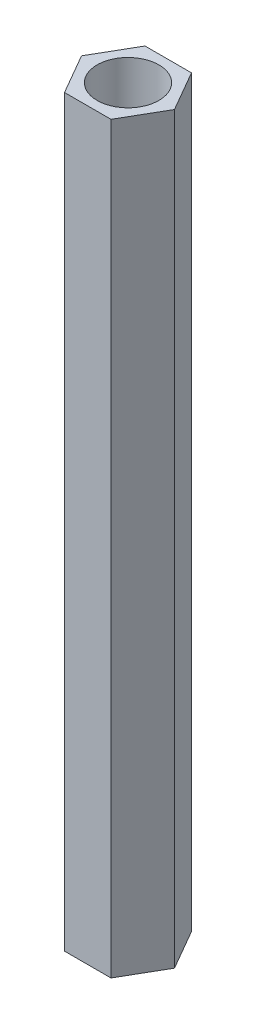
ISO-10303-21;
HEADER;
FILE_DESCRIPTION(('STEP AP214'),'2;1');
FILE_NAME('part.step','',(''),(''),'','','');
FILE_SCHEMA(('AUTOMOTIVE_DESIGN { 1 0 10303 214 1 1 1 1 }'));
ENDSEC;
DATA;
#1=APPLICATION_CONTEXT('core data for automotive mechanical design processes');
#2=APPLICATION_PROTOCOL_DEFINITION('international standard','automotive_design',2000,#1);
#3=PRODUCT_CONTEXT('',#1,'mechanical');
#4=PRODUCT('Part','Part','',(#3));
#5=PRODUCT_RELATED_PRODUCT_CATEGORY('part','',(#4));
#6=PRODUCT_DEFINITION_FORMATION('','',#4);
#7=PRODUCT_DEFINITION_CONTEXT('part definition',#1,'design');
#8=PRODUCT_DEFINITION('design','',#6,#7);
#9=PRODUCT_DEFINITION_SHAPE('','',#8);
#10=(LENGTH_UNIT() NAMED_UNIT(*) SI_UNIT(.MILLI.,.METRE.));
#11=(NAMED_UNIT(*) PLANE_ANGLE_UNIT() SI_UNIT($,.RADIAN.));
#12=(NAMED_UNIT(*) SI_UNIT($,.STERADIAN.) SOLID_ANGLE_UNIT());
#13=UNCERTAINTY_MEASURE_WITH_UNIT(LENGTH_MEASURE(1.E-05),#10,'distance_accuracy_value','');
#14=(GEOMETRIC_REPRESENTATION_CONTEXT(3) GLOBAL_UNCERTAINTY_ASSIGNED_CONTEXT((#13)) GLOBAL_UNIT_ASSIGNED_CONTEXT((#10,
#11,#12)) REPRESENTATION_CONTEXT('',''));
#15=CARTESIAN_POINT('',(0.,0.,0.));
#16=DIRECTION('',(0.,0.,1.));
#17=DIRECTION('',(1.,0.,0.));
#18=AXIS2_PLACEMENT_3D('',#15,#16,#17);
#19=CARTESIAN_POINT('',(1.25000000000002,40.,2.16506350946108));
#20=DIRECTION('',(-0.866025403784441,0.,-0.499999999999995));
#21=DIRECTION('',(-0.499999999999995,0.,0.866025403784441));
#22=AXIS2_PLACEMENT_3D('',#19,#20,#21);
#23=PLANE('',#22);
#24=DIRECTION('',(0.499999999999995,0.,-0.866025403784441));
#25=VECTOR('',#24,1.);
#26=CARTESIAN_POINT('',(1.25000000000002,0.,2.16506350946108));
#27=LINE('',#26,#25);
#28=CARTESIAN_POINT('',(1.25000000000002,0.,2.16506350946108));
#29=VERTEX_POINT('',#28);
#30=CARTESIAN_POINT('',(2.5,0.,0.));
#31=VERTEX_POINT('',#30);
#32=EDGE_CURVE('E118',#29,#31,#27,.T.);
#33=ORIENTED_EDGE('',*,*,#32,.T.);
#34=DIRECTION('',(0.,-1.,0.));
#35=VECTOR('',#34,1.);
#36=CARTESIAN_POINT('',(2.5,40.,0.));
#37=LINE('',#36,#35);
#38=CARTESIAN_POINT('',(2.5,40.,0.));
#39=VERTEX_POINT('',#38);
#40=EDGE_CURVE('E11',#39,#31,#37,.T.);
#41=ORIENTED_EDGE('',*,*,#40,.F.);
#42=DIRECTION('',(0.499999999999995,0.,-0.866025403784441));
#43=VECTOR('',#42,1.);
#44=CARTESIAN_POINT('',(1.25000000000002,40.,2.16506350946108));
#45=LINE('',#44,#43);
#46=CARTESIAN_POINT('',(1.25000000000002,40.,2.16506350946108));
#47=VERTEX_POINT('',#46);
#48=EDGE_CURVE('E129',#47,#39,#45,.T.);
#49=ORIENTED_EDGE('',*,*,#48,.F.);
#50=DIRECTION('',(0.,-1.,0.));
#51=VECTOR('',#50,1.);
#52=CARTESIAN_POINT('',(1.25000000000002,40.,2.16506350946108));
#53=LINE('',#52,#51);
#54=EDGE_CURVE('E114',#47,#29,#53,.T.);
#55=ORIENTED_EDGE('',*,*,#54,.T.);
#56=EDGE_LOOP('',(#33,#41,#49,#55));
#57=FACE_BOUND('',#56,.T.);
#58=ADVANCED_FACE('F34',(#57),#23,.F.);
#59=CARTESIAN_POINT('',(2.5,40.,0.));
#60=DIRECTION('',(-0.866025403784438,0.,0.500000000000001));
#61=DIRECTION('',(0.500000000000001,0.,0.866025403784438));
#62=AXIS2_PLACEMENT_3D('',#59,#60,#61);
#63=PLANE('',#62);
#64=DIRECTION('',(-0.500000000000001,0.,-0.866025403784438));
#65=VECTOR('',#64,1.);
#66=CARTESIAN_POINT('',(2.5,0.,0.));
#67=LINE('',#66,#65);
#68=CARTESIAN_POINT('',(1.24999999999999,0.,-2.1650635094611));
#69=VERTEX_POINT('',#68);
#70=EDGE_CURVE('E121',#31,#69,#67,.T.);
#71=ORIENTED_EDGE('',*,*,#70,.T.);
#72=DIRECTION('',(0.,-1.,0.));
#73=VECTOR('',#72,1.);
#74=CARTESIAN_POINT('',(1.24999999999999,40.,-2.1650635094611));
#75=LINE('',#74,#73);
#76=CARTESIAN_POINT('',(1.24999999999999,40.,-2.1650635094611));
#77=VERTEX_POINT('',#76);
#78=EDGE_CURVE('E42',#77,#69,#75,.T.);
#79=ORIENTED_EDGE('',*,*,#78,.F.);
#80=DIRECTION('',(-0.500000000000001,0.,-0.866025403784438));
#81=VECTOR('',#80,1.);
#82=CARTESIAN_POINT('',(2.5,40.,0.));
#83=LINE('',#82,#81);
#84=EDGE_CURVE('E87',#39,#77,#83,.T.);
#85=ORIENTED_EDGE('',*,*,#84,.F.);
#86=ORIENTED_EDGE('',*,*,#40,.T.);
#87=EDGE_LOOP('',(#71,#79,#85,#86));
#88=FACE_BOUND('',#87,.T.);
#89=ADVANCED_FACE('F154',(#88),#63,.F.);
#90=CARTESIAN_POINT('',(1.24999999999999,40.,-2.1650635094611));
#91=DIRECTION('',(0.,0.,1.));
#92=DIRECTION('',(1.,0.,0.));
#93=AXIS2_PLACEMENT_3D('',#90,#91,#92);
#94=PLANE('',#93);
#95=DIRECTION('',(-1.,0.,0.));
#96=VECTOR('',#95,1.);
#97=CARTESIAN_POINT('',(1.24999999999999,0.,-2.1650635094611));
#98=LINE('',#97,#96);
#99=CARTESIAN_POINT('',(-1.25000000000001,0.,-2.16506350946109));
#100=VERTEX_POINT('',#99);
#101=EDGE_CURVE('E124',#69,#100,#98,.T.);
#102=ORIENTED_EDGE('',*,*,#101,.T.);
#103=DIRECTION('',(0.,-1.,0.));
#104=VECTOR('',#103,1.);
#105=CARTESIAN_POINT('',(-1.25000000000001,40.,-2.16506350946109));
#106=LINE('',#105,#104);
#107=CARTESIAN_POINT('',(-1.25000000000001,40.,-2.16506350946109));
#108=VERTEX_POINT('',#107);
#109=EDGE_CURVE('E109',#108,#100,#106,.T.);
#110=ORIENTED_EDGE('',*,*,#109,.F.);
#111=DIRECTION('',(-1.,0.,0.));
#112=VECTOR('',#111,1.);
#113=CARTESIAN_POINT('',(1.24999999999999,40.,-2.1650635094611));
#114=LINE('',#113,#112);
#115=EDGE_CURVE('E100',#77,#108,#114,.T.);
#116=ORIENTED_EDGE('',*,*,#115,.F.);
#117=ORIENTED_EDGE('',*,*,#78,.T.);
#118=EDGE_LOOP('',(#102,#110,#116,#117));
#119=FACE_BOUND('',#118,.T.);
#120=ADVANCED_FACE('F135',(#119),#94,.F.);
#121=CARTESIAN_POINT('',(-1.25000000000001,40.,-2.16506350946109));
#122=DIRECTION('',(0.866025403784442,0.,0.499999999999995));
#123=DIRECTION('',(0.499999999999995,0.,-0.866025403784442));
#124=AXIS2_PLACEMENT_3D('',#121,#122,#123);
#125=PLANE('',#124);
#126=DIRECTION('',(-0.499999999999995,0.,0.866025403784442));
#127=VECTOR('',#126,1.);
#128=CARTESIAN_POINT('',(-1.25000000000001,0.,-2.16506350946109));
#129=LINE('',#128,#127);
#130=CARTESIAN_POINT('',(-2.5,0.,0.));
#131=VERTEX_POINT('',#130);
#132=EDGE_CURVE('E108',#100,#131,#129,.T.);
#133=ORIENTED_EDGE('',*,*,#132,.T.);
#134=DIRECTION('',(0.,-1.,0.));
#135=VECTOR('',#134,1.);
#136=CARTESIAN_POINT('',(-2.5,40.,0.));
#137=LINE('',#136,#135);
#138=CARTESIAN_POINT('',(-2.5,40.,0.));
#139=VERTEX_POINT('',#138);
#140=EDGE_CURVE('E105',#139,#131,#137,.T.);
#141=ORIENTED_EDGE('',*,*,#140,.F.);
#142=DIRECTION('',(-0.499999999999995,0.,0.866025403784442));
#143=VECTOR('',#142,1.);
#144=CARTESIAN_POINT('',(-1.25000000000001,40.,-2.16506350946109));
#145=LINE('',#144,#143);
#146=EDGE_CURVE('E94',#108,#139,#145,.T.);
#147=ORIENTED_EDGE('',*,*,#146,.F.);
#148=ORIENTED_EDGE('',*,*,#109,.T.);
#149=EDGE_LOOP('',(#133,#141,#147,#148));
#150=FACE_BOUND('',#149,.T.);
#151=ADVANCED_FACE('F106',(#150),#125,.F.);
#152=CARTESIAN_POINT('',(-2.5,40.,0.));
#153=DIRECTION('',(0.866025403784434,0.,-0.500000000000007));
#154=DIRECTION('',(-0.500000000000007,0.,-0.866025403784435));
#155=AXIS2_PLACEMENT_3D('',#152,#153,#154);
#156=PLANE('',#155);
#157=DIRECTION('',(0.500000000000007,0.,0.866025403784434));
#158=VECTOR('',#157,1.);
#159=CARTESIAN_POINT('',(-2.5,0.,0.));
#160=LINE('',#159,#158);
#161=CARTESIAN_POINT('',(-1.24999999999998,0.,2.1650635094611));
#162=VERTEX_POINT('',#161);
#163=EDGE_CURVE('E73',#131,#162,#160,.T.);
#164=ORIENTED_EDGE('',*,*,#163,.T.);
#165=DIRECTION('',(0.,-1.,0.));
#166=VECTOR('',#165,1.);
#167=CARTESIAN_POINT('',(-1.24999999999998,40.,2.1650635094611));
#168=LINE('',#167,#166);
#169=CARTESIAN_POINT('',(-1.24999999999998,40.,2.1650635094611));
#170=VERTEX_POINT('',#169);
#171=EDGE_CURVE('E110',#170,#162,#168,.T.);
#172=ORIENTED_EDGE('',*,*,#171,.F.);
#173=DIRECTION('',(0.500000000000007,0.,0.866025403784434));
#174=VECTOR('',#173,1.);
#175=CARTESIAN_POINT('',(-2.5,40.,0.));
#176=LINE('',#175,#174);
#177=EDGE_CURVE('E98',#139,#170,#176,.T.);
#178=ORIENTED_EDGE('',*,*,#177,.F.);
#179=ORIENTED_EDGE('',*,*,#140,.T.);
#180=EDGE_LOOP('',(#164,#172,#178,#179));
#181=FACE_BOUND('',#180,.T.);
#182=ADVANCED_FACE('F112',(#181),#156,.F.);
#183=CARTESIAN_POINT('',(-1.24999999999998,40.,2.1650635094611));
#184=DIRECTION('',(0.,0.,-1.));
#185=DIRECTION('',(-1.,0.,0.));
#186=AXIS2_PLACEMENT_3D('',#183,#184,#185);
#187=PLANE('',#186);
#188=DIRECTION('',(1.,0.,0.));
#189=VECTOR('',#188,1.);
#190=CARTESIAN_POINT('',(-1.24999999999998,0.,2.1650635094611));
#191=LINE('',#190,#189);
#192=EDGE_CURVE('E79',#162,#29,#191,.T.);
#193=ORIENTED_EDGE('',*,*,#192,.T.);
#194=ORIENTED_EDGE('',*,*,#54,.F.);
#195=DIRECTION('',(1.,0.,0.));
#196=VECTOR('',#195,1.);
#197=CARTESIAN_POINT('',(-1.24999999999998,40.,2.1650635094611));
#198=LINE('',#197,#196);
#199=EDGE_CURVE('E50',#170,#47,#198,.T.);
#200=ORIENTED_EDGE('',*,*,#199,.F.);
#201=ORIENTED_EDGE('',*,*,#171,.T.);
#202=EDGE_LOOP('',(#193,#194,#200,#201));
#203=FACE_BOUND('',#202,.T.);
#204=ADVANCED_FACE('F142',(#203),#187,.F.);
#205=CARTESIAN_POINT('',(0.,40.,0.));
#206=DIRECTION('',(0.,1.,0.));
#207=DIRECTION('',(0.,0.,1.));
#208=AXIS2_PLACEMENT_3D('',#205,#206,#207);
#209=PLANE('',#208);
#210=CARTESIAN_POINT('',(0.,40.,0.));
#211=DIRECTION('',(0.,1.,0.));
#212=DIRECTION('',(0.,0.,1.));
#213=AXIS2_PLACEMENT_3D('',#210,#211,#212);
#214=CIRCLE('',#213,1.6603858136733);
#215=CARTESIAN_POINT('',(0.,40.,1.6603858136733));
#216=VERTEX_POINT('',#215);
#217=EDGE_CURVE('E209',#216,#216,#214,.T.);
#218=ORIENTED_EDGE('',*,*,#217,.F.);
#219=EDGE_LOOP('',(#218));
#220=FACE_BOUND('',#219,.T.);
#221=ORIENTED_EDGE('',*,*,#48,.T.);
#222=ORIENTED_EDGE('',*,*,#84,.T.);
#223=ORIENTED_EDGE('',*,*,#115,.T.);
#224=ORIENTED_EDGE('',*,*,#146,.T.);
#225=ORIENTED_EDGE('',*,*,#177,.T.);
#226=ORIENTED_EDGE('',*,*,#199,.T.);
#227=EDGE_LOOP('',(#221,#222,#223,#224,#225,#226));
#228=FACE_BOUND('',#227,.T.);
#229=ADVANCED_FACE('F96',(#220,#228),#209,.T.);
#230=CARTESIAN_POINT('',(0.,0.,0.));
#231=DIRECTION('',(0.,1.,0.));
#232=DIRECTION('',(0.,0.,1.));
#233=AXIS2_PLACEMENT_3D('',#230,#231,#232);
#234=PLANE('',#233);
#235=CARTESIAN_POINT('',(0.,0.,0.));
#236=DIRECTION('',(0.,1.,0.));
#237=DIRECTION('',(0.,0.,1.));
#238=AXIS2_PLACEMENT_3D('',#235,#236,#237);
#239=CIRCLE('',#238,1.6603858136733);
#240=CARTESIAN_POINT('',(0.,0.,1.6603858136733));
#241=VERTEX_POINT('',#240);
#242=EDGE_CURVE('E122',#241,#241,#239,.T.);
#243=ORIENTED_EDGE('',*,*,#242,.T.);
#244=EDGE_LOOP('',(#243));
#245=FACE_BOUND('',#244,.T.);
#246=ORIENTED_EDGE('',*,*,#32,.F.);
#247=ORIENTED_EDGE('',*,*,#192,.F.);
#248=ORIENTED_EDGE('',*,*,#163,.F.);
#249=ORIENTED_EDGE('',*,*,#132,.F.);
#250=ORIENTED_EDGE('',*,*,#101,.F.);
#251=ORIENTED_EDGE('',*,*,#70,.F.);
#252=EDGE_LOOP('',(#246,#247,#248,#249,#250,#251));
#253=FACE_BOUND('',#252,.T.);
#254=ADVANCED_FACE('F138',(#245,#253),#234,.F.);
#255=CARTESIAN_POINT('',(0.,0.,0.));
#256=DIRECTION('',(0.,1.,0.));
#257=DIRECTION('',(0.,0.,1.));
#258=AXIS2_PLACEMENT_3D('',#255,#256,#257);
#259=CYLINDRICAL_SURFACE('',#258,1.6603858136733);
#260=ORIENTED_EDGE('',*,*,#242,.F.);
#261=EDGE_LOOP('',(#260));
#262=FACE_BOUND('',#261,.T.);
#263=ORIENTED_EDGE('',*,*,#217,.T.);
#264=EDGE_LOOP('',(#263));
#265=FACE_BOUND('',#264,.T.);
#266=ADVANCED_FACE('F191',(#262,#265),#259,.F.);
#267=CLOSED_SHELL('',(#58,#89,#120,#151,#182,#204,#229,#254,#266));
#268=MANIFOLD_SOLID_BREP('B2',#267);
#269=ADVANCED_BREP_SHAPE_REPRESENTATION('',(#18,#268),#14);
#270=SHAPE_DEFINITION_REPRESENTATION(#9,#269);
ENDSEC;
END-ISO-10303-21;
